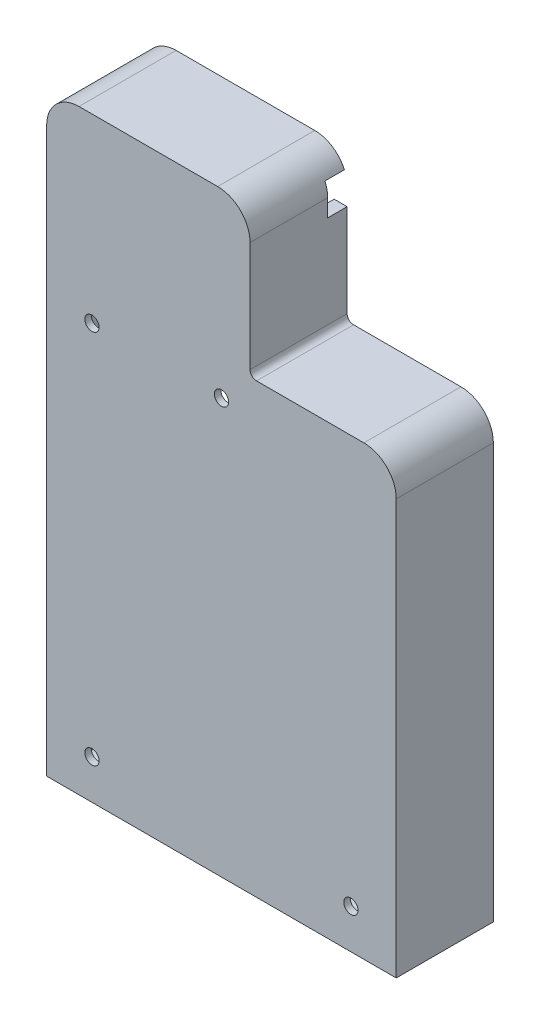
ISO-10303-21;
HEADER;
FILE_DESCRIPTION(('STEP AP214'),'2;1');
FILE_NAME('part.step','',(''),(''),'','','');
FILE_SCHEMA(('AUTOMOTIVE_DESIGN { 1 0 10303 214 1 1 1 1 }'));
ENDSEC;
DATA;
#1=APPLICATION_CONTEXT('core data for automotive mechanical design processes');
#2=APPLICATION_PROTOCOL_DEFINITION('international standard','automotive_design',2000,#1);
#3=PRODUCT_CONTEXT('',#1,'mechanical');
#4=PRODUCT('Part','Part','',(#3));
#5=PRODUCT_RELATED_PRODUCT_CATEGORY('part','',(#4));
#6=PRODUCT_DEFINITION_FORMATION('','',#4);
#7=PRODUCT_DEFINITION_CONTEXT('part definition',#1,'design');
#8=PRODUCT_DEFINITION('design','',#6,#7);
#9=PRODUCT_DEFINITION_SHAPE('','',#8);
#10=(LENGTH_UNIT() NAMED_UNIT(*) SI_UNIT(.MILLI.,.METRE.));
#11=(NAMED_UNIT(*) PLANE_ANGLE_UNIT() SI_UNIT($,.RADIAN.));
#12=(NAMED_UNIT(*) SI_UNIT($,.STERADIAN.) SOLID_ANGLE_UNIT());
#13=UNCERTAINTY_MEASURE_WITH_UNIT(LENGTH_MEASURE(1.E-05),#10,'distance_accuracy_value','');
#14=(GEOMETRIC_REPRESENTATION_CONTEXT(3) GLOBAL_UNCERTAINTY_ASSIGNED_CONTEXT((#13)) GLOBAL_UNIT_ASSIGNED_CONTEXT((#10,
#11,#12)) REPRESENTATION_CONTEXT('',''));
#15=CARTESIAN_POINT('',(0.,0.,0.));
#16=DIRECTION('',(0.,0.,1.));
#17=DIRECTION('',(1.,0.,0.));
#18=AXIS2_PLACEMENT_3D('',#15,#16,#17);
#19=CARTESIAN_POINT('',(834.649003168395,1097.58833023332,1303.47290301832));
#20=DIRECTION('',(0.,0.,1.));
#21=DIRECTION('',(1.,0.,0.));
#22=AXIS2_PLACEMENT_3D('',#19,#20,#21);
#23=PLANE('',#22);
#24=DIRECTION('',(-1.,0.,0.));
#25=VECTOR('',#24,1.);
#26=CARTESIAN_POINT('',(791.526705461344,1122.616605257,1303.47290301832));
#27=LINE('',#26,#25);
#28=CARTESIAN_POINT('',(788.439253952946,1122.616605257,1303.47290301832));
#29=VERTEX_POINT('',#28);
#30=CARTESIAN_POINT('',(786.0798629798,1122.616605257,1303.47290301832));
#31=VERTEX_POINT('',#30);
#32=EDGE_CURVE('E237',#29,#31,#27,.T.);
#33=ORIENTED_EDGE('',*,*,#32,.T.);
#34=CARTESIAN_POINT('',(790.651191574185,1120.58833023332,1303.47290301832));
#35=DIRECTION('',(0.,0.,1.));
#36=DIRECTION('',(1.,0.,0.));
#37=AXIS2_PLACEMENT_3D('',#34,#35,#36);
#38=CIRCLE('',#37,5.00109434919231);
#39=CARTESIAN_POINT('',(790.649732770005,1125.58942436975,1303.47290301832));
#40=VERTEX_POINT('',#39);
#41=EDGE_CURVE('E254',#40,#31,#38,.T.);
#42=ORIENTED_EDGE('',*,*,#41,.F.);
#43=DIRECTION('',(-1.,-1.14045923215985E-13,0.));
#44=VECTOR('',#43,1.);
#45=CARTESIAN_POINT('',(790.649732770005,1125.58942436975,1303.47290301832));
#46=LINE('',#45,#44);
#47=CARTESIAN_POINT('',(812.066461972588,1125.58942436976,1303.47290301832));
#48=VERTEX_POINT('',#47);
#49=EDGE_CURVE('E259',#48,#40,#46,.T.);
#50=ORIENTED_EDGE('',*,*,#49,.F.);
#51=CARTESIAN_POINT('',(812.065003168395,1120.58833023332,1303.47290301832));
#52=DIRECTION('',(0.,0.,1.));
#53=DIRECTION('',(1.,0.,0.));
#54=AXIS2_PLACEMENT_3D('',#51,#52,#53);
#55=CIRCLE('',#54,5.00109434919731);
#56=CARTESIAN_POINT('',(816.636331762786,1122.616605257,1303.47290301832));
#57=VERTEX_POINT('',#56);
#58=EDGE_CURVE('E453',#57,#48,#55,.T.);
#59=ORIENTED_EDGE('',*,*,#58,.F.);
#60=DIRECTION('',(-1.,0.,0.));
#61=VECTOR('',#60,1.);
#62=CARTESIAN_POINT('',(809.844363200608,1122.616605257,1303.47290301832));
#63=LINE('',#62,#61);
#64=CARTESIAN_POINT('',(814.276940789641,1122.616605257,1303.47290301832));
#65=VERTEX_POINT('',#64);
#66=EDGE_CURVE('E327',#57,#65,#63,.T.);
#67=ORIENTED_EDGE('',*,*,#66,.T.);
#68=CARTESIAN_POINT('',(812.065003168395,1120.58833023332,1303.47290301832));
#69=DIRECTION('',(0.,0.,1.));
#70=DIRECTION('',(1.,0.,0.));
#71=AXIS2_PLACEMENT_3D('',#68,#69,#70);
#72=CIRCLE('',#71,3.00109440237386);
#73=CARTESIAN_POINT('',(812.066097371295,1123.58942443622,1303.47290301832));
#74=VERTEX_POINT('',#73);
#75=EDGE_CURVE('E394',#65,#74,#72,.T.);
#76=ORIENTED_EDGE('',*,*,#75,.T.);
#77=DIRECTION('',(-1.,-2.28099612829224E-13,0.));
#78=VECTOR('',#77,1.);
#79=CARTESIAN_POINT('',(790.650097371295,1123.58942443622,1303.47290301832));
#80=LINE('',#79,#78);
#81=CARTESIAN_POINT('',(790.650097371295,1123.58942443622,1303.47290301832));
#82=VERTEX_POINT('',#81);
#83=EDGE_CURVE('E396',#74,#82,#80,.T.);
#84=ORIENTED_EDGE('',*,*,#83,.T.);
#85=CARTESIAN_POINT('',(790.651191574185,1120.58833023332,1303.47290301832));
#86=DIRECTION('',(0.,0.,1.));
#87=DIRECTION('',(1.,0.,0.));
#88=AXIS2_PLACEMENT_3D('',#85,#86,#87);
#89=CIRCLE('',#88,3.00109440236892);
#90=EDGE_CURVE('E356',#82,#29,#89,.T.);
#91=ORIENTED_EDGE('',*,*,#90,.T.);
#92=EDGE_LOOP('',(#33,#42,#50,#59,#67,#76,#84,#91));
#93=FACE_BOUND('',#92,.T.);
#94=ADVANCED_FACE('F41',(#93),#23,.F.);
#95=DIRECTION('',(1.,0.,0.));
#96=VECTOR('',#95,1.);
#97=CARTESIAN_POINT('',(791.526705461344,1117.89524788642,1303.47290301832));
#98=LINE('',#97,#96);
#99=CARTESIAN_POINT('',(785.650097436732,1117.89524788642,1303.47290301832));
#100=VERTEX_POINT('',#99);
#101=CARTESIAN_POINT('',(787.65009737129,1117.89524788642,1303.47290301832));
#102=VERTEX_POINT('',#101);
#103=EDGE_CURVE('E228',#100,#102,#98,.T.);
#104=ORIENTED_EDGE('',*,*,#103,.T.);
#105=DIRECTION('',(0.,-1.,0.));
#106=VECTOR('',#105,1.);
#107=CARTESIAN_POINT('',(787.650097371295,1035.49652121042,1303.47290301832));
#108=LINE('',#107,#106);
#109=CARTESIAN_POINT('',(787.650097371295,1035.49652121042,1303.47290301832));
#110=VERTEX_POINT('',#109);
#111=EDGE_CURVE('E247',#102,#110,#108,.T.);
#112=ORIENTED_EDGE('',*,*,#111,.T.);
#113=DIRECTION('',(1.,0.,0.));
#114=VECTOR('',#113,1.);
#115=CARTESIAN_POINT('',(787.650097371295,1035.49652121042,1303.47290301832));
#116=LINE('',#115,#114);
#117=CARTESIAN_POINT('',(837.650097371295,1035.49652121042,1303.47290301832));
#118=VERTEX_POINT('',#117);
#119=EDGE_CURVE('E376',#110,#118,#116,.T.);
#120=ORIENTED_EDGE('',*,*,#119,.T.);
#121=DIRECTION('',(0.,1.,0.));
#122=VECTOR('',#121,1.);
#123=CARTESIAN_POINT('',(837.650097371295,1097.58942443622,1303.47290301832));
#124=LINE('',#123,#122);
#125=CARTESIAN_POINT('',(837.650097371295,1097.58942443622,1303.47290301832));
#126=VERTEX_POINT('',#125);
#127=EDGE_CURVE('E379',#118,#126,#124,.T.);
#128=ORIENTED_EDGE('',*,*,#127,.T.);
#129=CARTESIAN_POINT('',(834.649003168395,1097.58833023332,1303.47290301832));
#130=DIRECTION('',(0.,0.,1.));
#131=DIRECTION('',(1.,0.,0.));
#132=AXIS2_PLACEMENT_3D('',#129,#130,#131);
#133=CIRCLE('',#132,3.00109440237403);
#134=CARTESIAN_POINT('',(834.650097371295,1100.58942443622,1303.47290301832));
#135=VERTEX_POINT('',#134);
#136=EDGE_CURVE('E382',#126,#135,#133,.T.);
#137=ORIENTED_EDGE('',*,*,#136,.T.);
#138=DIRECTION('',(-1.,0.,0.));
#139=VECTOR('',#138,1.);
#140=CARTESIAN_POINT('',(818.066097371295,1100.58942443622,1303.47290301832));
#141=LINE('',#140,#139);
#142=CARTESIAN_POINT('',(818.066097371295,1100.58942443622,1303.47290301832));
#143=VERTEX_POINT('',#142);
#144=EDGE_CURVE('E385',#135,#143,#141,.T.);
#145=ORIENTED_EDGE('',*,*,#144,.T.);
#146=CARTESIAN_POINT('',(818.067191574185,1103.59051863911,1303.47290301832));
#147=DIRECTION('',(0.,0.,-1.));
#148=DIRECTION('',(1.,0.,0.));
#149=AXIS2_PLACEMENT_3D('',#146,#147,#148);
#150=CIRCLE('',#149,3.00109440236392);
#151=CARTESIAN_POINT('',(815.066097371295,1103.58942443622,1303.47290301832));
#152=VERTEX_POINT('',#151);
#153=EDGE_CURVE('E388',#143,#152,#150,.T.);
#154=ORIENTED_EDGE('',*,*,#153,.T.);
#155=DIRECTION('',(0.,1.,0.));
#156=VECTOR('',#155,1.);
#157=CARTESIAN_POINT('',(815.066097371295,1120.58942443622,1303.47290301832));
#158=LINE('',#157,#156);
#159=CARTESIAN_POINT('',(815.066097371295,1117.89524788642,1303.47290301832));
#160=VERTEX_POINT('',#159);
#161=EDGE_CURVE('E391',#152,#160,#158,.T.);
#162=ORIENTED_EDGE('',*,*,#161,.T.);
#163=DIRECTION('',(1.,0.,0.));
#164=VECTOR('',#163,1.);
#165=CARTESIAN_POINT('',(809.844363200608,1117.89524788642,1303.47290301832));
#166=LINE('',#165,#164);
#167=CARTESIAN_POINT('',(817.066097304828,1117.89524788642,1303.47290301832));
#168=VERTEX_POINT('',#167);
#169=EDGE_CURVE('E330',#160,#168,#166,.T.);
#170=ORIENTED_EDGE('',*,*,#169,.T.);
#171=DIRECTION('',(0.,1.,0.));
#172=VECTOR('',#171,1.);
#173=CARTESIAN_POINT('',(817.066097304828,1120.58978903752,1303.47290301832));
#174=LINE('',#173,#172);
#175=CARTESIAN_POINT('',(817.066097304828,1103.58978903751,1303.47290301832));
#176=VERTEX_POINT('',#175);
#177=EDGE_CURVE('E450',#176,#168,#174,.T.);
#178=ORIENTED_EDGE('',*,*,#177,.F.);
#179=CARTESIAN_POINT('',(818.067191574185,1103.59051863911,1303.47290301832));
#180=DIRECTION('',(0.,0.,-1.));
#181=DIRECTION('',(1.,0.,0.));
#182=AXIS2_PLACEMENT_3D('',#179,#180,#181);
#183=CIRCLE('',#182,1.00109453522535);
#184=CARTESIAN_POINT('',(818.066461972585,1102.58942436976,1303.47290301832));
#185=VERTEX_POINT('',#184);
#186=EDGE_CURVE('E448',#185,#176,#183,.T.);
#187=ORIENTED_EDGE('',*,*,#186,.F.);
#188=DIRECTION('',(-1.,0.,0.));
#189=VECTOR('',#188,1.);
#190=CARTESIAN_POINT('',(818.066461972585,1102.58942436976,1303.47290301832));
#191=LINE('',#190,#189);
#192=CARTESIAN_POINT('',(834.650461972588,1102.58942436976,1303.47290301832));
#193=VERTEX_POINT('',#192);
#194=EDGE_CURVE('E446',#193,#185,#191,.T.);
#195=ORIENTED_EDGE('',*,*,#194,.F.);
#196=CARTESIAN_POINT('',(834.649003168395,1097.58833023332,1303.47290301832));
#197=DIRECTION('',(0.,0.,1.));
#198=DIRECTION('',(1.,0.,0.));
#199=AXIS2_PLACEMENT_3D('',#196,#197,#198);
#200=CIRCLE('',#199,5.00109434919747);
#201=CARTESIAN_POINT('',(839.650097304828,1097.58978903752,1303.47290301832));
#202=VERTEX_POINT('',#201);
#203=EDGE_CURVE('E424',#202,#193,#200,.T.);
#204=ORIENTED_EDGE('',*,*,#203,.F.);
#205=DIRECTION('',(-1.03703643668424E-09,1.,0.));
#206=VECTOR('',#205,1.);
#207=CARTESIAN_POINT('',(839.650097304828,1097.58978903752,1303.47290301832));
#208=LINE('',#207,#206);
#209=CARTESIAN_POINT('',(839.650097371295,1033.49652121042,1303.47290301832));
#210=VERTEX_POINT('',#209);
#211=EDGE_CURVE('E256',#210,#202,#208,.T.);
#212=ORIENTED_EDGE('',*,*,#211,.F.);
#213=DIRECTION('',(1.,0.,0.));
#214=VECTOR('',#213,1.);
#215=CARTESIAN_POINT('',(785.650097371295,1033.49652121042,1303.47290301832));
#216=LINE('',#215,#214);
#217=CARTESIAN_POINT('',(785.650097371295,1033.49652121042,1303.47290301832));
#218=VERTEX_POINT('',#217);
#219=EDGE_CURVE('E253',#218,#210,#216,.T.);
#220=ORIENTED_EDGE('',*,*,#219,.F.);
#221=DIRECTION('',(-7.63142929992677E-10,-1.,0.));
#222=VECTOR('',#221,1.);
#223=CARTESIAN_POINT('',(785.650097371295,1033.49652121042,1303.47290301832));
#224=LINE('',#223,#222);
#225=EDGE_CURVE('E243',#100,#218,#224,.T.);
#226=ORIENTED_EDGE('',*,*,#225,.F.);
#227=EDGE_LOOP('',(#104,#112,#120,#128,#137,#145,#154,#162,#170,#178,#187,#195,#204,#212,#220,#226));
#228=FACE_BOUND('',#227,.T.);
#229=ADVANCED_FACE('F251',(#228),#23,.F.);
#230=CARTESIAN_POINT('',(817.066097304828,1120.58978903752,1318.47290301832));
#231=DIRECTION('',(-1.,0.,0.));
#232=DIRECTION('',(0.,0.,1.));
#233=AXIS2_PLACEMENT_3D('',#230,#231,#232);
#234=PLANE('',#233);
#235=DIRECTION('',(0.,0.,-1.));
#236=VECTOR('',#235,1.);
#237=CARTESIAN_POINT('',(817.066097304828,1117.89524788642,1318.47290301832));
#238=LINE('',#237,#236);
#239=CARTESIAN_POINT('',(817.066097304828,1117.89524788642,1306.47290301832));
#240=VERTEX_POINT('',#239);
#241=EDGE_CURVE('E248',#240,#168,#238,.T.);
#242=ORIENTED_EDGE('',*,*,#241,.F.);
#243=DIRECTION('',(0.,1.,0.));
#244=VECTOR('',#243,1.);
#245=CARTESIAN_POINT('',(817.066097304828,1120.58978903752,1306.47290301832));
#246=LINE('',#245,#244);
#247=CARTESIAN_POINT('',(817.066097304828,1120.58978903752,1306.47290301832));
#248=VERTEX_POINT('',#247);
#249=EDGE_CURVE('E346',#240,#248,#246,.T.);
#250=ORIENTED_EDGE('',*,*,#249,.T.);
#251=DIRECTION('',(0.,0.,-1.));
#252=VECTOR('',#251,1.);
#253=CARTESIAN_POINT('',(817.066097304828,1120.58978903752,1318.47290301832));
#254=LINE('',#253,#252);
#255=CARTESIAN_POINT('',(817.066097304828,1120.58978903752,1318.47290301832));
#256=VERTEX_POINT('',#255);
#257=EDGE_CURVE('E282',#256,#248,#254,.T.);
#258=ORIENTED_EDGE('',*,*,#257,.F.);
#259=DIRECTION('',(0.,1.,0.));
#260=VECTOR('',#259,1.);
#261=CARTESIAN_POINT('',(817.066097304828,1120.58978903752,1318.47290301832));
#262=LINE('',#261,#260);
#263=CARTESIAN_POINT('',(817.066097304828,1103.58978903751,1318.47290301832));
#264=VERTEX_POINT('',#263);
#265=EDGE_CURVE('E431',#264,#256,#262,.T.);
#266=ORIENTED_EDGE('',*,*,#265,.F.);
#267=DIRECTION('',(0.,0.,-1.));
#268=VECTOR('',#267,1.);
#269=CARTESIAN_POINT('',(817.066097304828,1103.58978903751,1318.47290301832));
#270=LINE('',#269,#268);
#271=EDGE_CURVE('E285',#264,#176,#270,.T.);
#272=ORIENTED_EDGE('',*,*,#271,.T.);
#273=ORIENTED_EDGE('',*,*,#177,.T.);
#274=EDGE_LOOP('',(#242,#250,#258,#266,#272,#273));
#275=FACE_BOUND('',#274,.T.);
#276=ADVANCED_FACE('F538',(#275),#234,.F.);
#277=CARTESIAN_POINT('',(812.065003168395,1120.58833023332,1318.47290301832));
#278=DIRECTION('',(0.,0.,-1.));
#279=DIRECTION('',(-1.,0.,0.));
#280=AXIS2_PLACEMENT_3D('',#277,#278,#279);
#281=CYLINDRICAL_SURFACE('',#280,5.00109434919731);
#282=DIRECTION('',(0.,0.,-1.));
#283=VECTOR('',#282,1.);
#284=CARTESIAN_POINT('',(816.636331762786,1122.616605257,1318.47290301832));
#285=LINE('',#284,#283);
#286=CARTESIAN_POINT('',(816.636331762786,1122.616605257,1306.47290301832));
#287=VERTEX_POINT('',#286);
#288=EDGE_CURVE('E349',#57,#287,#285,.F.);
#289=ORIENTED_EDGE('',*,*,#288,.F.);
#290=ORIENTED_EDGE('',*,*,#58,.T.);
#291=DIRECTION('',(0.,0.,-1.));
#292=VECTOR('',#291,1.);
#293=CARTESIAN_POINT('',(812.066461972588,1125.58942436976,1318.47290301832));
#294=LINE('',#293,#292);
#295=CARTESIAN_POINT('',(812.066461972588,1125.58942436976,1318.47290301832));
#296=VERTEX_POINT('',#295);
#297=EDGE_CURVE('E279',#296,#48,#294,.T.);
#298=ORIENTED_EDGE('',*,*,#297,.F.);
#299=CARTESIAN_POINT('',(812.065003168395,1120.58833023332,1318.47290301832));
#300=DIRECTION('',(0.,0.,1.));
#301=DIRECTION('',(1.,0.,0.));
#302=AXIS2_PLACEMENT_3D('',#299,#300,#301);
#303=CIRCLE('',#302,5.00109434919731);
#304=EDGE_CURVE('E433',#256,#296,#303,.T.);
#305=ORIENTED_EDGE('',*,*,#304,.F.);
#306=ORIENTED_EDGE('',*,*,#257,.T.);
#307=CARTESIAN_POINT('',(812.065003168395,1120.58833023332,1306.47290301832));
#308=DIRECTION('',(0.,0.,1.));
#309=DIRECTION('',(1.,0.,0.));
#310=AXIS2_PLACEMENT_3D('',#307,#308,#309);
#311=CIRCLE('',#310,5.00109434919731);
#312=EDGE_CURVE('E343',#248,#287,#311,.T.);
#313=ORIENTED_EDGE('',*,*,#312,.T.);
#314=EDGE_LOOP('',(#289,#290,#298,#305,#306,#313));
#315=FACE_BOUND('',#314,.T.);
#316=ADVANCED_FACE('F502',(#315),#281,.T.);
#317=CARTESIAN_POINT('',(790.651191574185,1120.58833023332,1318.47290301832));
#318=DIRECTION('',(0.,0.,-1.));
#319=DIRECTION('',(-1.,0.,0.));
#320=AXIS2_PLACEMENT_3D('',#317,#318,#319);
#321=CYLINDRICAL_SURFACE('',#320,5.00109434919231);
#322=DIRECTION('',(0.,0.,-1.));
#323=VECTOR('',#322,1.);
#324=CARTESIAN_POINT('',(786.0798629798,1122.616605257,1318.47290301832));
#325=LINE('',#324,#323);
#326=CARTESIAN_POINT('',(786.0798629798,1122.616605257,1306.47290301832));
#327=VERTEX_POINT('',#326);
#328=EDGE_CURVE('E340',#327,#31,#325,.T.);
#329=ORIENTED_EDGE('',*,*,#328,.F.);
#330=CARTESIAN_POINT('',(790.651191574185,1120.58833023332,1306.47290301832));
#331=DIRECTION('',(0.,0.,-1.));
#332=DIRECTION('',(-1.,0.,0.));
#333=AXIS2_PLACEMENT_3D('',#330,#331,#332);
#334=CIRCLE('',#333,5.00109434919231);
#335=CARTESIAN_POINT('',(785.65009743776,1120.58978903752,1306.47290301832));
#336=VERTEX_POINT('',#335);
#337=EDGE_CURVE('E338',#336,#327,#334,.T.);
#338=ORIENTED_EDGE('',*,*,#337,.F.);
#339=DIRECTION('',(0.,0.,-1.));
#340=VECTOR('',#339,1.);
#341=CARTESIAN_POINT('',(785.65009743776,1120.58978903752,1318.47290301832));
#342=LINE('',#341,#340);
#343=CARTESIAN_POINT('',(785.65009743776,1120.58978903752,1318.47290301832));
#344=VERTEX_POINT('',#343);
#345=EDGE_CURVE('E274',#344,#336,#342,.T.);
#346=ORIENTED_EDGE('',*,*,#345,.F.);
#347=CARTESIAN_POINT('',(790.651191574185,1120.58833023332,1318.47290301832));
#348=DIRECTION('',(0.,0.,1.));
#349=DIRECTION('',(1.,0.,0.));
#350=AXIS2_PLACEMENT_3D('',#347,#348,#349);
#351=CIRCLE('',#350,5.00109434919231);
#352=CARTESIAN_POINT('',(790.649732770005,1125.58942436975,1318.47290301832));
#353=VERTEX_POINT('',#352);
#354=EDGE_CURVE('E437',#353,#344,#351,.T.);
#355=ORIENTED_EDGE('',*,*,#354,.F.);
#356=DIRECTION('',(0.,0.,-1.));
#357=VECTOR('',#356,1.);
#358=CARTESIAN_POINT('',(790.649732770005,1125.58942436975,1318.47290301832));
#359=LINE('',#358,#357);
#360=EDGE_CURVE('E276',#353,#40,#359,.T.);
#361=ORIENTED_EDGE('',*,*,#360,.T.);
#362=ORIENTED_EDGE('',*,*,#41,.T.);
#363=EDGE_LOOP('',(#329,#338,#346,#355,#361,#362));
#364=FACE_BOUND('',#363,.T.);
#365=ADVANCED_FACE('F466',(#364),#321,.T.);
#366=CARTESIAN_POINT('',(785.650097371295,1033.49652121042,1318.47290301832));
#367=DIRECTION('',(1.,-7.63142929992677E-10,0.));
#368=DIRECTION('',(7.63142929992677E-10,1.,0.));
#369=AXIS2_PLACEMENT_3D('',#366,#367,#368);
#370=PLANE('',#369);
#371=DIRECTION('',(0.,0.,1.));
#372=VECTOR('',#371,1.);
#373=CARTESIAN_POINT('',(785.650097435704,1117.89524788642,1318.47290301832));
#374=LINE('',#373,#372);
#375=CARTESIAN_POINT('',(785.650097436732,1117.89524788642,1306.47290301832));
#376=VERTEX_POINT('',#375);
#377=EDGE_CURVE('E232',#100,#376,#374,.T.);
#378=ORIENTED_EDGE('',*,*,#377,.F.);
#379=ORIENTED_EDGE('',*,*,#225,.T.);
#380=DIRECTION('',(0.,0.,-1.));
#381=VECTOR('',#380,1.);
#382=CARTESIAN_POINT('',(785.650097371295,1033.49652121042,1318.47290301832));
#383=LINE('',#382,#381);
#384=CARTESIAN_POINT('',(785.650097371295,1033.49652121042,1318.47290301832));
#385=VERTEX_POINT('',#384);
#386=EDGE_CURVE('E272',#385,#218,#383,.T.);
#387=ORIENTED_EDGE('',*,*,#386,.F.);
#388=DIRECTION('',(-7.63142929992677E-10,-1.,0.));
#389=VECTOR('',#388,1.);
#390=CARTESIAN_POINT('',(785.650097371295,1033.49652121042,1318.47290301832));
#391=LINE('',#390,#389);
#392=EDGE_CURVE('E439',#344,#385,#391,.T.);
#393=ORIENTED_EDGE('',*,*,#392,.F.);
#394=ORIENTED_EDGE('',*,*,#345,.T.);
#395=DIRECTION('',(7.63142929992677E-10,1.,0.));
#396=VECTOR('',#395,1.);
#397=CARTESIAN_POINT('',(785.650097371295,1033.49652121042,1306.47290301832));
#398=LINE('',#397,#396);
#399=EDGE_CURVE('E246',#376,#336,#398,.T.);
#400=ORIENTED_EDGE('',*,*,#399,.F.);
#401=EDGE_LOOP('',(#378,#379,#387,#393,#394,#400));
#402=FACE_BOUND('',#401,.T.);
#403=ADVANCED_FACE('F241',(#402),#370,.F.);
#404=CARTESIAN_POINT('',(787.650097371295,1035.49652121042,1317.47290301832));
#405=DIRECTION('',(1.,0.,0.));
#406=DIRECTION('',(0.,1.,0.));
#407=AXIS2_PLACEMENT_3D('',#404,#405,#406);
#408=PLANE('',#407);
#409=ORIENTED_EDGE('',*,*,#111,.F.);
#410=DIRECTION('',(0.,0.,1.));
#411=VECTOR('',#410,1.);
#412=CARTESIAN_POINT('',(787.65009737129,1117.89524788642,1317.47290301832));
#413=LINE('',#412,#411);
#414=CARTESIAN_POINT('',(787.65009737129,1117.89524788642,1306.47290301832));
#415=VERTEX_POINT('',#414);
#416=EDGE_CURVE('E11',#102,#415,#413,.T.);
#417=ORIENTED_EDGE('',*,*,#416,.T.);
#418=DIRECTION('',(0.,1.,0.));
#419=VECTOR('',#418,1.);
#420=CARTESIAN_POINT('',(787.650097371295,1035.49652121042,1306.47290301832));
#421=LINE('',#420,#419);
#422=CARTESIAN_POINT('',(787.65009737129,1120.58942443622,1306.47290301832));
#423=VERTEX_POINT('',#422);
#424=EDGE_CURVE('E333',#415,#423,#421,.T.);
#425=ORIENTED_EDGE('',*,*,#424,.T.);
#426=DIRECTION('',(0.,0.,-1.));
#427=VECTOR('',#426,1.);
#428=CARTESIAN_POINT('',(787.65009737129,1120.58942443622,1317.47290301832));
#429=LINE('',#428,#427);
#430=CARTESIAN_POINT('',(787.65009737129,1120.58942443622,1317.47290301832));
#431=VERTEX_POINT('',#430);
#432=EDGE_CURVE('E374',#431,#423,#429,.T.);
#433=ORIENTED_EDGE('',*,*,#432,.F.);
#434=DIRECTION('',(0.,-1.,0.));
#435=VECTOR('',#434,1.);
#436=CARTESIAN_POINT('',(787.650097371295,1035.49652121042,1317.47290301832));
#437=LINE('',#436,#435);
#438=CARTESIAN_POINT('',(787.650097371295,1035.49652121042,1317.47290301832));
#439=VERTEX_POINT('',#438);
#440=EDGE_CURVE('E352',#431,#439,#437,.T.);
#441=ORIENTED_EDGE('',*,*,#440,.T.);
#442=DIRECTION('',(0.,0.,-1.));
#443=VECTOR('',#442,1.);
#444=CARTESIAN_POINT('',(787.650097371295,1035.49652121042,1317.47290301832));
#445=LINE('',#444,#443);
#446=EDGE_CURVE('E421',#439,#110,#445,.T.);
#447=ORIENTED_EDGE('',*,*,#446,.T.);
#448=EDGE_LOOP('',(#409,#417,#425,#433,#441,#447));
#449=FACE_BOUND('',#448,.T.);
#450=ADVANCED_FACE('F517',(#449),#408,.T.);
#451=CARTESIAN_POINT('',(815.066097371295,1120.58942443622,1317.47290301832));
#452=DIRECTION('',(-1.,0.,0.));
#453=DIRECTION('',(0.,0.,1.));
#454=AXIS2_PLACEMENT_3D('',#451,#452,#453);
#455=PLANE('',#454);
#456=DIRECTION('',(0.,1.,0.));
#457=VECTOR('',#456,1.);
#458=CARTESIAN_POINT('',(815.066097371295,1120.58942443622,1306.47290301832));
#459=LINE('',#458,#457);
#460=CARTESIAN_POINT('',(815.066097371295,1117.89524788642,1306.47290301832));
#461=VERTEX_POINT('',#460);
#462=CARTESIAN_POINT('',(815.066097371295,1120.58942443622,1306.47290301832));
#463=VERTEX_POINT('',#462);
#464=EDGE_CURVE('E58',#461,#463,#459,.T.);
#465=ORIENTED_EDGE('',*,*,#464,.F.);
#466=DIRECTION('',(0.,0.,-1.));
#467=VECTOR('',#466,1.);
#468=CARTESIAN_POINT('',(815.066097371295,1117.89524788642,1317.47290301832));
#469=LINE('',#468,#467);
#470=EDGE_CURVE('E50',#461,#160,#469,.T.);
#471=ORIENTED_EDGE('',*,*,#470,.T.);
#472=ORIENTED_EDGE('',*,*,#161,.F.);
#473=DIRECTION('',(0.,0.,-1.));
#474=VECTOR('',#473,1.);
#475=CARTESIAN_POINT('',(815.066097371295,1103.58942443622,1317.47290301832));
#476=LINE('',#475,#474);
#477=CARTESIAN_POINT('',(815.066097371295,1103.58942443622,1317.47290301832));
#478=VERTEX_POINT('',#477);
#479=EDGE_CURVE('E411',#478,#152,#476,.T.);
#480=ORIENTED_EDGE('',*,*,#479,.F.);
#481=DIRECTION('',(0.,1.,0.));
#482=VECTOR('',#481,1.);
#483=CARTESIAN_POINT('',(815.066097371295,1120.58942443622,1317.47290301832));
#484=LINE('',#483,#482);
#485=CARTESIAN_POINT('',(815.066097371295,1120.58942443622,1317.47290301832));
#486=VERTEX_POINT('',#485);
#487=EDGE_CURVE('E366',#478,#486,#484,.T.);
#488=ORIENTED_EDGE('',*,*,#487,.T.);
#489=DIRECTION('',(0.,0.,-1.));
#490=VECTOR('',#489,1.);
#491=CARTESIAN_POINT('',(815.066097371295,1120.58942443622,1317.47290301832));
#492=LINE('',#491,#490);
#493=EDGE_CURVE('E408',#486,#463,#492,.T.);
#494=ORIENTED_EDGE('',*,*,#493,.T.);
#495=EDGE_LOOP('',(#465,#471,#472,#480,#488,#494));
#496=FACE_BOUND('',#495,.T.);
#497=ADVANCED_FACE('F506',(#496),#455,.T.);
#498=CARTESIAN_POINT('',(812.065003168395,1120.58833023332,1317.47290301832));
#499=DIRECTION('',(0.,0.,-1.));
#500=DIRECTION('',(-1.,0.,0.));
#501=AXIS2_PLACEMENT_3D('',#498,#499,#500);
#502=CYLINDRICAL_SURFACE('',#501,3.00109440237386);
#503=ORIENTED_EDGE('',*,*,#75,.F.);
#504=DIRECTION('',(0.,0.,-1.));
#505=VECTOR('',#504,1.);
#506=CARTESIAN_POINT('',(814.276940789641,1122.616605257,1317.47290301832));
#507=LINE('',#506,#505);
#508=CARTESIAN_POINT('',(814.276940789641,1122.616605257,1306.47290301832));
#509=VERTEX_POINT('',#508);
#510=EDGE_CURVE('E302',#65,#509,#507,.F.);
#511=ORIENTED_EDGE('',*,*,#510,.T.);
#512=CARTESIAN_POINT('',(812.065003168395,1120.58833023332,1306.47290301832));
#513=DIRECTION('',(0.,0.,1.));
#514=DIRECTION('',(1.,0.,0.));
#515=AXIS2_PLACEMENT_3D('',#512,#513,#514);
#516=CIRCLE('',#515,3.00109440237386);
#517=EDGE_CURVE('E300',#463,#509,#516,.T.);
#518=ORIENTED_EDGE('',*,*,#517,.F.);
#519=ORIENTED_EDGE('',*,*,#493,.F.);
#520=CARTESIAN_POINT('',(812.065003168395,1120.58833023332,1317.47290301832));
#521=DIRECTION('',(0.,0.,1.));
#522=DIRECTION('',(1.,0.,0.));
#523=AXIS2_PLACEMENT_3D('',#520,#521,#522);
#524=CIRCLE('',#523,3.00109440237386);
#525=CARTESIAN_POINT('',(812.066097371295,1123.58942443622,1317.47290301832));
#526=VERTEX_POINT('',#525);
#527=EDGE_CURVE('E368',#486,#526,#524,.T.);
#528=ORIENTED_EDGE('',*,*,#527,.T.);
#529=DIRECTION('',(0.,0.,-1.));
#530=VECTOR('',#529,1.);
#531=CARTESIAN_POINT('',(812.066097371295,1123.58942443622,1317.47290301832));
#532=LINE('',#531,#530);
#533=EDGE_CURVE('E405',#526,#74,#532,.T.);
#534=ORIENTED_EDGE('',*,*,#533,.T.);
#535=EDGE_LOOP('',(#503,#511,#518,#519,#528,#534));
#536=FACE_BOUND('',#535,.T.);
#537=ADVANCED_FACE('F479',(#536),#502,.F.);
#538=CARTESIAN_POINT('',(790.651191574185,1120.58833023332,1317.47290301832));
#539=DIRECTION('',(0.,0.,-1.));
#540=DIRECTION('',(-1.,0.,0.));
#541=AXIS2_PLACEMENT_3D('',#538,#539,#540);
#542=CYLINDRICAL_SURFACE('',#541,3.00109440236892);
#543=CARTESIAN_POINT('',(790.651191574185,1120.58833023332,1306.47290301832));
#544=DIRECTION('',(0.,0.,-1.));
#545=DIRECTION('',(-1.,0.,0.));
#546=AXIS2_PLACEMENT_3D('',#543,#544,#545);
#547=CIRCLE('',#546,3.00109440236892);
#548=CARTESIAN_POINT('',(788.439253952946,1122.616605257,1306.47290301832));
#549=VERTEX_POINT('',#548);
#550=EDGE_CURVE('E294',#423,#549,#547,.T.);
#551=ORIENTED_EDGE('',*,*,#550,.T.);
#552=DIRECTION('',(0.,0.,-1.));
#553=VECTOR('',#552,1.);
#554=CARTESIAN_POINT('',(788.439253952946,1122.616605257,1317.47290301832));
#555=LINE('',#554,#553);
#556=EDGE_CURVE('E297',#549,#29,#555,.T.);
#557=ORIENTED_EDGE('',*,*,#556,.T.);
#558=ORIENTED_EDGE('',*,*,#90,.F.);
#559=DIRECTION('',(0.,0.,-1.));
#560=VECTOR('',#559,1.);
#561=CARTESIAN_POINT('',(790.650097371295,1123.58942443622,1317.47290301832));
#562=LINE('',#561,#560);
#563=CARTESIAN_POINT('',(790.650097371295,1123.58942443622,1317.47290301832));
#564=VERTEX_POINT('',#563);
#565=EDGE_CURVE('E403',#564,#82,#562,.T.);
#566=ORIENTED_EDGE('',*,*,#565,.F.);
#567=CARTESIAN_POINT('',(790.651191574185,1120.58833023332,1317.47290301832));
#568=DIRECTION('',(0.,0.,1.));
#569=DIRECTION('',(1.,0.,0.));
#570=AXIS2_PLACEMENT_3D('',#567,#568,#569);
#571=CIRCLE('',#570,3.00109440236892);
#572=EDGE_CURVE('E372',#564,#431,#571,.T.);
#573=ORIENTED_EDGE('',*,*,#572,.T.);
#574=ORIENTED_EDGE('',*,*,#432,.T.);
#575=EDGE_LOOP('',(#551,#557,#558,#566,#573,#574));
#576=FACE_BOUND('',#575,.T.);
#577=ADVANCED_FACE('F490',(#576),#542,.F.);
#578=CARTESIAN_POINT('',(834.649003168395,1097.58833023332,1318.47290301832));
#579=DIRECTION('',(0.,0.,1.));
#580=DIRECTION('',(1.,0.,0.));
#581=AXIS2_PLACEMENT_3D('',#578,#579,#580);
#582=PLANE('',#581);
#583=CARTESIAN_POINT('',(832.650097371295,1039.58942443622,1318.47290301832));
#584=DIRECTION('',(0.,0.,1.));
#585=DIRECTION('',(1.,0.,0.));
#586=AXIS2_PLACEMENT_3D('',#583,#584,#585);
#587=CIRCLE('',#586,1.09999999999997);
#588=CARTESIAN_POINT('',(833.750097371295,1039.58942443622,1318.47290301832));
#589=VERTEX_POINT('',#588);
#590=EDGE_CURVE('E311',#589,#589,#587,.T.);
#591=ORIENTED_EDGE('',*,*,#590,.F.);
#592=EDGE_LOOP('',(#591));
#593=FACE_BOUND('',#592,.T.);
#594=CARTESIAN_POINT('',(792.650097371295,1039.58942443622,1318.47290301832));
#595=DIRECTION('',(0.,0.,1.));
#596=DIRECTION('',(1.,0.,0.));
#597=AXIS2_PLACEMENT_3D('',#594,#595,#596);
#598=CIRCLE('',#597,1.10000000000008);
#599=CARTESIAN_POINT('',(793.750097371295,1039.58942443622,1318.47290301832));
#600=VERTEX_POINT('',#599);
#601=EDGE_CURVE('E792',#600,#600,#598,.T.);
#602=ORIENTED_EDGE('',*,*,#601,.F.);
#603=EDGE_LOOP('',(#602));
#604=FACE_BOUND('',#603,.T.);
#605=CARTESIAN_POINT('',(792.650097371295,1097.58942443622,1318.47290301832));
#606=DIRECTION('',(0.,0.,1.));
#607=DIRECTION('',(1.,0.,0.));
#608=AXIS2_PLACEMENT_3D('',#605,#606,#607);
#609=CIRCLE('',#608,1.10000000000008);
#610=CARTESIAN_POINT('',(793.750097371295,1097.58942443622,1318.47290301832));
#611=VERTEX_POINT('',#610);
#612=EDGE_CURVE('E795',#611,#611,#609,.T.);
#613=ORIENTED_EDGE('',*,*,#612,.F.);
#614=EDGE_LOOP('',(#613));
#615=FACE_BOUND('',#614,.T.);
#616=CARTESIAN_POINT('',(812.650097371295,1097.58942443622,1318.47290301832));
#617=DIRECTION('',(0.,0.,1.));
#618=DIRECTION('',(1.,0.,0.));
#619=AXIS2_PLACEMENT_3D('',#616,#617,#618);
#620=CIRCLE('',#619,1.09999999999997);
#621=CARTESIAN_POINT('',(813.750097371295,1097.58942443622,1318.47290301832));
#622=VERTEX_POINT('',#621);
#623=EDGE_CURVE('E800',#622,#622,#620,.T.);
#624=ORIENTED_EDGE('',*,*,#623,.F.);
#625=EDGE_LOOP('',(#624));
#626=FACE_BOUND('',#625,.T.);
#627=CARTESIAN_POINT('',(834.649003168395,1097.58833023332,1318.47290301832));
#628=DIRECTION('',(0.,0.,1.));
#629=DIRECTION('',(1.,0.,0.));
#630=AXIS2_PLACEMENT_3D('',#627,#628,#629);
#631=CIRCLE('',#630,5.00109434919747);
#632=CARTESIAN_POINT('',(839.650097304828,1097.58978903752,1318.47290301832));
#633=VERTEX_POINT('',#632);
#634=CARTESIAN_POINT('',(834.650461972588,1102.58942436976,1318.47290301832));
#635=VERTEX_POINT('',#634);
#636=EDGE_CURVE('E264',#633,#635,#631,.T.);
#637=ORIENTED_EDGE('',*,*,#636,.T.);
#638=DIRECTION('',(-1.,0.,0.));
#639=VECTOR('',#638,1.);
#640=CARTESIAN_POINT('',(818.066461972585,1102.58942436976,1318.47290301832));
#641=LINE('',#640,#639);
#642=CARTESIAN_POINT('',(818.066461972585,1102.58942436976,1318.47290301832));
#643=VERTEX_POINT('',#642);
#644=EDGE_CURVE('E427',#635,#643,#641,.T.);
#645=ORIENTED_EDGE('',*,*,#644,.T.);
#646=CARTESIAN_POINT('',(818.067191574185,1103.59051863911,1318.47290301832));
#647=DIRECTION('',(0.,0.,-1.));
#648=DIRECTION('',(1.,0.,0.));
#649=AXIS2_PLACEMENT_3D('',#646,#647,#648);
#650=CIRCLE('',#649,1.00109453522535);
#651=EDGE_CURVE('E429',#643,#264,#650,.T.);
#652=ORIENTED_EDGE('',*,*,#651,.T.);
#653=ORIENTED_EDGE('',*,*,#265,.T.);
#654=ORIENTED_EDGE('',*,*,#304,.T.);
#655=DIRECTION('',(-1.,-1.14045923215985E-13,0.));
#656=VECTOR('',#655,1.);
#657=CARTESIAN_POINT('',(790.649732770005,1125.58942436975,1318.47290301832));
#658=LINE('',#657,#656);
#659=EDGE_CURVE('E435',#296,#353,#658,.T.);
#660=ORIENTED_EDGE('',*,*,#659,.T.);
#661=ORIENTED_EDGE('',*,*,#354,.T.);
#662=ORIENTED_EDGE('',*,*,#392,.T.);
#663=DIRECTION('',(1.,0.,0.));
#664=VECTOR('',#663,1.);
#665=CARTESIAN_POINT('',(785.650097371295,1033.49652121042,1318.47290301832));
#666=LINE('',#665,#664);
#667=CARTESIAN_POINT('',(839.650097371295,1033.49652121042,1318.47290301832));
#668=VERTEX_POINT('',#667);
#669=EDGE_CURVE('E441',#385,#668,#666,.T.);
#670=ORIENTED_EDGE('',*,*,#669,.T.);
#671=DIRECTION('',(-1.03703643668424E-09,1.,0.));
#672=VECTOR('',#671,1.);
#673=CARTESIAN_POINT('',(839.650097304828,1097.58978903752,1318.47290301832));
#674=LINE('',#673,#672);
#675=EDGE_CURVE('E269',#668,#633,#674,.T.);
#676=ORIENTED_EDGE('',*,*,#675,.T.);
#677=EDGE_LOOP('',(#637,#645,#652,#653,#654,#660,#661,#662,#670,#676));
#678=FACE_BOUND('',#677,.T.);
#679=ADVANCED_FACE('F496',(#593,#604,#615,#626,#678),#582,.T.);
#680=CARTESIAN_POINT('',(834.649003168395,1097.58833023332,1318.47290301832));
#681=DIRECTION('',(0.,0.,-1.));
#682=DIRECTION('',(-1.,0.,0.));
#683=AXIS2_PLACEMENT_3D('',#680,#681,#682);
#684=CYLINDRICAL_SURFACE('',#683,5.00109434919747);
#685=ORIENTED_EDGE('',*,*,#203,.T.);
#686=DIRECTION('',(0.,0.,-1.));
#687=VECTOR('',#686,1.);
#688=CARTESIAN_POINT('',(834.650461972588,1102.58942436976,1318.47290301832));
#689=LINE('',#688,#687);
#690=EDGE_CURVE('E291',#635,#193,#689,.T.);
#691=ORIENTED_EDGE('',*,*,#690,.F.);
#692=ORIENTED_EDGE('',*,*,#636,.F.);
#693=DIRECTION('',(0.,0.,-1.));
#694=VECTOR('',#693,1.);
#695=CARTESIAN_POINT('',(839.650097304828,1097.58978903752,1318.47290301832));
#696=LINE('',#695,#694);
#697=EDGE_CURVE('E265',#633,#202,#696,.T.);
#698=ORIENTED_EDGE('',*,*,#697,.T.);
#699=EDGE_LOOP('',(#685,#691,#692,#698));
#700=FACE_BOUND('',#699,.T.);
#701=ADVANCED_FACE('F43',(#700),#684,.T.);
#702=CARTESIAN_POINT('',(818.066461972585,1102.58942436976,1318.47290301832));
#703=DIRECTION('',(0.,-1.,0.));
#704=DIRECTION('',(0.,0.,-1.));
#705=AXIS2_PLACEMENT_3D('',#702,#703,#704);
#706=PLANE('',#705);
#707=ORIENTED_EDGE('',*,*,#194,.T.);
#708=DIRECTION('',(0.,0.,-1.));
#709=VECTOR('',#708,1.);
#710=CARTESIAN_POINT('',(818.066461972585,1102.58942436976,1318.47290301832));
#711=LINE('',#710,#709);
#712=EDGE_CURVE('E288',#643,#185,#711,.T.);
#713=ORIENTED_EDGE('',*,*,#712,.F.);
#714=ORIENTED_EDGE('',*,*,#644,.F.);
#715=ORIENTED_EDGE('',*,*,#690,.T.);
#716=EDGE_LOOP('',(#707,#713,#714,#715));
#717=FACE_BOUND('',#716,.T.);
#718=ADVANCED_FACE('F564',(#717),#706,.F.);
#719=CARTESIAN_POINT('',(818.067191574185,1103.59051863911,1318.47290301832));
#720=DIRECTION('',(0.,0.,-1.));
#721=DIRECTION('',(-1.,0.,0.));
#722=AXIS2_PLACEMENT_3D('',#719,#720,#721);
#723=CYLINDRICAL_SURFACE('',#722,1.00109453522535);
#724=ORIENTED_EDGE('',*,*,#186,.T.);
#725=ORIENTED_EDGE('',*,*,#271,.F.);
#726=ORIENTED_EDGE('',*,*,#651,.F.);
#727=ORIENTED_EDGE('',*,*,#712,.T.);
#728=EDGE_LOOP('',(#724,#725,#726,#727));
#729=FACE_BOUND('',#728,.T.);
#730=ADVANCED_FACE('F557',(#729),#723,.F.);
#731=CARTESIAN_POINT('',(790.649732770005,1125.58942436975,1318.47290301832));
#732=DIRECTION('',(1.14045923215985E-13,-1.,0.));
#733=DIRECTION('',(1.,1.14045923215985E-13,0.));
#734=AXIS2_PLACEMENT_3D('',#731,#732,#733);
#735=PLANE('',#734);
#736=ORIENTED_EDGE('',*,*,#49,.T.);
#737=ORIENTED_EDGE('',*,*,#360,.F.);
#738=ORIENTED_EDGE('',*,*,#659,.F.);
#739=ORIENTED_EDGE('',*,*,#297,.T.);
#740=EDGE_LOOP('',(#736,#737,#738,#739));
#741=FACE_BOUND('',#740,.T.);
#742=ADVANCED_FACE('F457',(#741),#735,.F.);
#743=CARTESIAN_POINT('',(785.650097371295,1033.49652121042,1318.47290301832));
#744=DIRECTION('',(0.,1.,0.));
#745=DIRECTION('',(0.,0.,1.));
#746=AXIS2_PLACEMENT_3D('',#743,#744,#745);
#747=PLANE('',#746);
#748=ORIENTED_EDGE('',*,*,#219,.T.);
#749=DIRECTION('',(0.,0.,-1.));
#750=VECTOR('',#749,1.);
#751=CARTESIAN_POINT('',(839.650097371295,1033.49652121042,1318.47290301832));
#752=LINE('',#751,#750);
#753=EDGE_CURVE('E268',#668,#210,#752,.T.);
#754=ORIENTED_EDGE('',*,*,#753,.F.);
#755=ORIENTED_EDGE('',*,*,#669,.F.);
#756=ORIENTED_EDGE('',*,*,#386,.T.);
#757=EDGE_LOOP('',(#748,#754,#755,#756));
#758=FACE_BOUND('',#757,.T.);
#759=ADVANCED_FACE('F546',(#758),#747,.F.);
#760=CARTESIAN_POINT('',(839.650097304828,1097.58978903752,1318.47290301832));
#761=DIRECTION('',(-1.,-1.03703643668424E-09,0.));
#762=DIRECTION('',(1.03703643668424E-09,-1.,0.));
#763=AXIS2_PLACEMENT_3D('',#760,#761,#762);
#764=PLANE('',#763);
#765=ORIENTED_EDGE('',*,*,#211,.T.);
#766=ORIENTED_EDGE('',*,*,#697,.F.);
#767=ORIENTED_EDGE('',*,*,#675,.F.);
#768=ORIENTED_EDGE('',*,*,#753,.T.);
#769=EDGE_LOOP('',(#765,#766,#767,#768));
#770=FACE_BOUND('',#769,.T.);
#771=ADVANCED_FACE('F542',(#770),#764,.F.);
#772=CARTESIAN_POINT('',(787.650097371295,1035.49652121042,1317.47290301832));
#773=DIRECTION('',(0.,1.,0.));
#774=DIRECTION('',(0.,0.,1.));
#775=AXIS2_PLACEMENT_3D('',#772,#773,#774);
#776=PLANE('',#775);
#777=ORIENTED_EDGE('',*,*,#119,.F.);
#778=ORIENTED_EDGE('',*,*,#446,.F.);
#779=DIRECTION('',(1.,0.,0.));
#780=VECTOR('',#779,1.);
#781=CARTESIAN_POINT('',(787.650097371295,1035.49652121042,1317.47290301832));
#782=LINE('',#781,#780);
#783=CARTESIAN_POINT('',(837.650097371295,1035.49652121042,1317.47290301832));
#784=VERTEX_POINT('',#783);
#785=EDGE_CURVE('E355',#439,#784,#782,.T.);
#786=ORIENTED_EDGE('',*,*,#785,.T.);
#787=DIRECTION('',(0.,0.,-1.));
#788=VECTOR('',#787,1.);
#789=CARTESIAN_POINT('',(837.650097371295,1035.49652121042,1317.47290301832));
#790=LINE('',#789,#788);
#791=EDGE_CURVE('E419',#784,#118,#790,.T.);
#792=ORIENTED_EDGE('',*,*,#791,.T.);
#793=EDGE_LOOP('',(#777,#778,#786,#792));
#794=FACE_BOUND('',#793,.T.);
#795=ADVANCED_FACE('F545',(#794),#776,.T.);
#796=CARTESIAN_POINT('',(837.650097371295,1097.58942443622,1317.47290301832));
#797=DIRECTION('',(-1.,0.,0.));
#798=DIRECTION('',(0.,0.,1.));
#799=AXIS2_PLACEMENT_3D('',#796,#797,#798);
#800=PLANE('',#799);
#801=ORIENTED_EDGE('',*,*,#127,.F.);
#802=ORIENTED_EDGE('',*,*,#791,.F.);
#803=DIRECTION('',(0.,1.,0.));
#804=VECTOR('',#803,1.);
#805=CARTESIAN_POINT('',(837.650097371295,1097.58942443622,1317.47290301832));
#806=LINE('',#805,#804);
#807=CARTESIAN_POINT('',(837.650097371295,1097.58942443622,1317.47290301832));
#808=VERTEX_POINT('',#807);
#809=EDGE_CURVE('E358',#784,#808,#806,.T.);
#810=ORIENTED_EDGE('',*,*,#809,.T.);
#811=DIRECTION('',(0.,0.,-1.));
#812=VECTOR('',#811,1.);
#813=CARTESIAN_POINT('',(837.650097371295,1097.58942443622,1317.47290301832));
#814=LINE('',#813,#812);
#815=EDGE_CURVE('E417',#808,#126,#814,.T.);
#816=ORIENTED_EDGE('',*,*,#815,.T.);
#817=EDGE_LOOP('',(#801,#802,#810,#816));
#818=FACE_BOUND('',#817,.T.);
#819=ADVANCED_FACE('F596',(#818),#800,.T.);
#820=CARTESIAN_POINT('',(834.649003168395,1097.58833023332,1317.47290301832));
#821=DIRECTION('',(0.,0.,-1.));
#822=DIRECTION('',(-1.,0.,0.));
#823=AXIS2_PLACEMENT_3D('',#820,#821,#822);
#824=CYLINDRICAL_SURFACE('',#823,3.00109440237403);
#825=ORIENTED_EDGE('',*,*,#136,.F.);
#826=ORIENTED_EDGE('',*,*,#815,.F.);
#827=CARTESIAN_POINT('',(834.649003168395,1097.58833023332,1317.47290301832));
#828=DIRECTION('',(0.,0.,1.));
#829=DIRECTION('',(1.,0.,0.));
#830=AXIS2_PLACEMENT_3D('',#827,#828,#829);
#831=CIRCLE('',#830,3.00109440237403);
#832=CARTESIAN_POINT('',(834.650097371295,1100.58942443622,1317.47290301832));
#833=VERTEX_POINT('',#832);
#834=EDGE_CURVE('E360',#808,#833,#831,.T.);
#835=ORIENTED_EDGE('',*,*,#834,.T.);
#836=DIRECTION('',(0.,0.,-1.));
#837=VECTOR('',#836,1.);
#838=CARTESIAN_POINT('',(834.650097371295,1100.58942443622,1317.47290301832));
#839=LINE('',#838,#837);
#840=EDGE_CURVE('E415',#833,#135,#839,.T.);
#841=ORIENTED_EDGE('',*,*,#840,.T.);
#842=EDGE_LOOP('',(#825,#826,#835,#841));
#843=FACE_BOUND('',#842,.T.);
#844=ADVANCED_FACE('F593',(#843),#824,.F.);
#845=CARTESIAN_POINT('',(818.066097371295,1100.58942443622,1317.47290301832));
#846=DIRECTION('',(0.,-1.,0.));
#847=DIRECTION('',(0.,0.,-1.));
#848=AXIS2_PLACEMENT_3D('',#845,#846,#847);
#849=PLANE('',#848);
#850=ORIENTED_EDGE('',*,*,#144,.F.);
#851=ORIENTED_EDGE('',*,*,#840,.F.);
#852=DIRECTION('',(-1.,0.,0.));
#853=VECTOR('',#852,1.);
#854=CARTESIAN_POINT('',(818.066097371295,1100.58942443622,1317.47290301832));
#855=LINE('',#854,#853);
#856=CARTESIAN_POINT('',(818.066097371295,1100.58942443622,1317.47290301832));
#857=VERTEX_POINT('',#856);
#858=EDGE_CURVE('E362',#833,#857,#855,.T.);
#859=ORIENTED_EDGE('',*,*,#858,.T.);
#860=DIRECTION('',(0.,0.,-1.));
#861=VECTOR('',#860,1.);
#862=CARTESIAN_POINT('',(818.066097371295,1100.58942443622,1317.47290301832));
#863=LINE('',#862,#861);
#864=EDGE_CURVE('E413',#857,#143,#863,.T.);
#865=ORIENTED_EDGE('',*,*,#864,.T.);
#866=EDGE_LOOP('',(#850,#851,#859,#865));
#867=FACE_BOUND('',#866,.T.);
#868=ADVANCED_FACE('F586',(#867),#849,.T.);
#869=CARTESIAN_POINT('',(818.067191574185,1103.59051863911,1317.47290301832));
#870=DIRECTION('',(0.,0.,-1.));
#871=DIRECTION('',(-1.,0.,0.));
#872=AXIS2_PLACEMENT_3D('',#869,#870,#871);
#873=CYLINDRICAL_SURFACE('',#872,3.00109440236392);
#874=ORIENTED_EDGE('',*,*,#153,.F.);
#875=ORIENTED_EDGE('',*,*,#864,.F.);
#876=CARTESIAN_POINT('',(818.067191574185,1103.59051863911,1317.47290301832));
#877=DIRECTION('',(0.,0.,-1.));
#878=DIRECTION('',(1.,0.,0.));
#879=AXIS2_PLACEMENT_3D('',#876,#877,#878);
#880=CIRCLE('',#879,3.00109440236392);
#881=EDGE_CURVE('E364',#857,#478,#880,.T.);
#882=ORIENTED_EDGE('',*,*,#881,.T.);
#883=ORIENTED_EDGE('',*,*,#479,.T.);
#884=EDGE_LOOP('',(#874,#875,#882,#883));
#885=FACE_BOUND('',#884,.T.);
#886=ADVANCED_FACE('F584',(#885),#873,.T.);
#887=CARTESIAN_POINT('',(790.650097371295,1123.58942443622,1317.47290301832));
#888=DIRECTION('',(2.28099612829224E-13,-1.,0.));
#889=DIRECTION('',(1.,2.28099612829224E-13,0.));
#890=AXIS2_PLACEMENT_3D('',#887,#888,#889);
#891=PLANE('',#890);
#892=ORIENTED_EDGE('',*,*,#83,.F.);
#893=ORIENTED_EDGE('',*,*,#533,.F.);
#894=DIRECTION('',(-1.,-2.28099612829224E-13,0.));
#895=VECTOR('',#894,1.);
#896=CARTESIAN_POINT('',(790.650097371295,1123.58942443622,1317.47290301832));
#897=LINE('',#896,#895);
#898=EDGE_CURVE('E370',#526,#564,#897,.T.);
#899=ORIENTED_EDGE('',*,*,#898,.T.);
#900=ORIENTED_EDGE('',*,*,#565,.T.);
#901=EDGE_LOOP('',(#892,#893,#899,#900));
#902=FACE_BOUND('',#901,.T.);
#903=ADVANCED_FACE('F486',(#902),#891,.T.);
#904=CARTESIAN_POINT('',(790.651191574185,1120.58833023332,1317.47290301832));
#905=DIRECTION('',(0.,0.,1.));
#906=DIRECTION('',(1.,0.,0.));
#907=AXIS2_PLACEMENT_3D('',#904,#905,#906);
#908=PLANE('',#907);
#909=CARTESIAN_POINT('',(832.650097371295,1039.58942443622,1317.47290301832));
#910=DIRECTION('',(0.,0.,1.));
#911=DIRECTION('',(1.,0.,0.));
#912=AXIS2_PLACEMENT_3D('',#909,#910,#911);
#913=CIRCLE('',#912,1.09999999999997);
#914=CARTESIAN_POINT('',(833.750097371295,1039.58942443622,1317.47290301832));
#915=VERTEX_POINT('',#914);
#916=EDGE_CURVE('E45',#915,#915,#913,.F.);
#917=ORIENTED_EDGE('',*,*,#916,.F.);
#918=EDGE_LOOP('',(#917));
#919=FACE_BOUND('',#918,.T.);
#920=CARTESIAN_POINT('',(792.650097371295,1039.58942443622,1317.47290301832));
#921=DIRECTION('',(0.,0.,1.));
#922=DIRECTION('',(1.,0.,0.));
#923=AXIS2_PLACEMENT_3D('',#920,#921,#922);
#924=CIRCLE('',#923,1.10000000000008);
#925=CARTESIAN_POINT('',(793.750097371295,1039.58942443622,1317.47290301832));
#926=VERTEX_POINT('',#925);
#927=EDGE_CURVE('E313',#926,#926,#924,.F.);
#928=ORIENTED_EDGE('',*,*,#927,.F.);
#929=EDGE_LOOP('',(#928));
#930=FACE_BOUND('',#929,.T.);
#931=CARTESIAN_POINT('',(792.650097371295,1097.58942443622,1317.47290301832));
#932=DIRECTION('',(0.,0.,1.));
#933=DIRECTION('',(1.,0.,0.));
#934=AXIS2_PLACEMENT_3D('',#931,#932,#933);
#935=CIRCLE('',#934,1.10000000000008);
#936=CARTESIAN_POINT('',(793.750097371295,1097.58942443622,1317.47290301832));
#937=VERTEX_POINT('',#936);
#938=EDGE_CURVE('E310',#937,#937,#935,.F.);
#939=ORIENTED_EDGE('',*,*,#938,.F.);
#940=EDGE_LOOP('',(#939));
#941=FACE_BOUND('',#940,.T.);
#942=CARTESIAN_POINT('',(812.650097371295,1097.58942443622,1317.47290301832));
#943=DIRECTION('',(0.,0.,1.));
#944=DIRECTION('',(1.,0.,0.));
#945=AXIS2_PLACEMENT_3D('',#942,#943,#944);
#946=CIRCLE('',#945,1.09999999999997);
#947=CARTESIAN_POINT('',(813.750097371295,1097.58942443622,1317.47290301832));
#948=VERTEX_POINT('',#947);
#949=EDGE_CURVE('E307',#948,#948,#946,.F.);
#950=ORIENTED_EDGE('',*,*,#949,.F.);
#951=EDGE_LOOP('',(#950));
#952=FACE_BOUND('',#951,.T.);
#953=ORIENTED_EDGE('',*,*,#440,.F.);
#954=ORIENTED_EDGE('',*,*,#572,.F.);
#955=ORIENTED_EDGE('',*,*,#898,.F.);
#956=ORIENTED_EDGE('',*,*,#527,.F.);
#957=ORIENTED_EDGE('',*,*,#487,.F.);
#958=ORIENTED_EDGE('',*,*,#881,.F.);
#959=ORIENTED_EDGE('',*,*,#858,.F.);
#960=ORIENTED_EDGE('',*,*,#834,.F.);
#961=ORIENTED_EDGE('',*,*,#809,.F.);
#962=ORIENTED_EDGE('',*,*,#785,.F.);
#963=EDGE_LOOP('',(#953,#954,#955,#956,#957,#958,#959,#960,#961,#962));
#964=FACE_BOUND('',#963,.T.);
#965=ADVANCED_FACE('F513',(#919,#930,#941,#952,#964),#908,.F.);
#966=CARTESIAN_POINT('',(791.526705461344,1117.89524788642,1306.47290301832));
#967=DIRECTION('',(0.,1.,0.));
#968=DIRECTION('',(0.,0.,1.));
#969=AXIS2_PLACEMENT_3D('',#966,#967,#968);
#970=PLANE('',#969);
#971=ORIENTED_EDGE('',*,*,#377,.T.);
#972=DIRECTION('',(1.,0.,0.));
#973=VECTOR('',#972,1.);
#974=CARTESIAN_POINT('',(791.526705461344,1117.89524788642,1306.47290301832));
#975=LINE('',#974,#973);
#976=EDGE_CURVE('E336',#376,#415,#975,.T.);
#977=ORIENTED_EDGE('',*,*,#976,.T.);
#978=ORIENTED_EDGE('',*,*,#416,.F.);
#979=ORIENTED_EDGE('',*,*,#103,.F.);
#980=EDGE_LOOP('',(#971,#977,#978,#979));
#981=FACE_BOUND('',#980,.T.);
#982=ADVANCED_FACE('F230',(#981),#970,.T.);
#983=CARTESIAN_POINT('',(791.526705461344,1122.616605257,1306.47290301832));
#984=DIRECTION('',(0.,-1.,0.));
#985=DIRECTION('',(0.,0.,-1.));
#986=AXIS2_PLACEMENT_3D('',#983,#984,#985);
#987=PLANE('',#986);
#988=ORIENTED_EDGE('',*,*,#328,.T.);
#989=ORIENTED_EDGE('',*,*,#32,.F.);
#990=ORIENTED_EDGE('',*,*,#556,.F.);
#991=DIRECTION('',(-1.,0.,0.));
#992=VECTOR('',#991,1.);
#993=CARTESIAN_POINT('',(791.526705461344,1122.616605257,1306.47290301832));
#994=LINE('',#993,#992);
#995=EDGE_CURVE('E66',#549,#327,#994,.T.);
#996=ORIENTED_EDGE('',*,*,#995,.T.);
#997=EDGE_LOOP('',(#988,#989,#990,#996));
#998=FACE_BOUND('',#997,.T.);
#999=ADVANCED_FACE('F491',(#998),#987,.T.);
#1000=CARTESIAN_POINT('',(0.,0.,1306.47290301832));
#1001=DIRECTION('',(0.,0.,-1.));
#1002=DIRECTION('',(-1.,0.,0.));
#1003=AXIS2_PLACEMENT_3D('',#1000,#1001,#1002);
#1004=PLANE('',#1003);
#1005=ORIENTED_EDGE('',*,*,#337,.T.);
#1006=ORIENTED_EDGE('',*,*,#995,.F.);
#1007=ORIENTED_EDGE('',*,*,#550,.F.);
#1008=ORIENTED_EDGE('',*,*,#424,.F.);
#1009=ORIENTED_EDGE('',*,*,#976,.F.);
#1010=ORIENTED_EDGE('',*,*,#399,.T.);
#1011=EDGE_LOOP('',(#1005,#1006,#1007,#1008,#1009,#1010));
#1012=FACE_BOUND('',#1011,.T.);
#1013=ADVANCED_FACE('F519',(#1012),#1004,.T.);
#1014=CARTESIAN_POINT('',(809.844363200608,1117.89524788642,1306.47290301832));
#1015=DIRECTION('',(0.,1.,0.));
#1016=DIRECTION('',(0.,0.,1.));
#1017=AXIS2_PLACEMENT_3D('',#1014,#1015,#1016);
#1018=PLANE('',#1017);
#1019=ORIENTED_EDGE('',*,*,#241,.T.);
#1020=ORIENTED_EDGE('',*,*,#169,.F.);
#1021=ORIENTED_EDGE('',*,*,#470,.F.);
#1022=DIRECTION('',(1.,0.,0.));
#1023=VECTOR('',#1022,1.);
#1024=CARTESIAN_POINT('',(809.844363200608,1117.89524788642,1306.47290301832));
#1025=LINE('',#1024,#1023);
#1026=EDGE_CURVE('E322',#461,#240,#1025,.T.);
#1027=ORIENTED_EDGE('',*,*,#1026,.T.);
#1028=EDGE_LOOP('',(#1019,#1020,#1021,#1027));
#1029=FACE_BOUND('',#1028,.T.);
#1030=ADVANCED_FACE('F521',(#1029),#1018,.T.);
#1031=CARTESIAN_POINT('',(809.844363200608,1122.616605257,1306.47290301832));
#1032=DIRECTION('',(0.,-1.,0.));
#1033=DIRECTION('',(0.,0.,-1.));
#1034=AXIS2_PLACEMENT_3D('',#1031,#1032,#1033);
#1035=PLANE('',#1034);
#1036=ORIENTED_EDGE('',*,*,#288,.T.);
#1037=DIRECTION('',(-1.,0.,0.));
#1038=VECTOR('',#1037,1.);
#1039=CARTESIAN_POINT('',(809.844363200608,1122.616605257,1306.47290301832));
#1040=LINE('',#1039,#1038);
#1041=EDGE_CURVE('E318',#287,#509,#1040,.T.);
#1042=ORIENTED_EDGE('',*,*,#1041,.T.);
#1043=ORIENTED_EDGE('',*,*,#510,.F.);
#1044=ORIENTED_EDGE('',*,*,#66,.F.);
#1045=EDGE_LOOP('',(#1036,#1042,#1043,#1044));
#1046=FACE_BOUND('',#1045,.T.);
#1047=ADVANCED_FACE('F503',(#1046),#1035,.T.);
#1048=CARTESIAN_POINT('',(0.,0.,1306.47290301832));
#1049=DIRECTION('',(0.,0.,1.));
#1050=DIRECTION('',(1.,0.,0.));
#1051=AXIS2_PLACEMENT_3D('',#1048,#1049,#1050);
#1052=PLANE('',#1051);
#1053=ORIENTED_EDGE('',*,*,#1026,.F.);
#1054=ORIENTED_EDGE('',*,*,#464,.T.);
#1055=ORIENTED_EDGE('',*,*,#517,.T.);
#1056=ORIENTED_EDGE('',*,*,#1041,.F.);
#1057=ORIENTED_EDGE('',*,*,#312,.F.);
#1058=ORIENTED_EDGE('',*,*,#249,.F.);
#1059=EDGE_LOOP('',(#1053,#1054,#1055,#1056,#1057,#1058));
#1060=FACE_BOUND('',#1059,.T.);
#1061=ADVANCED_FACE('F504',(#1060),#1052,.F.);
#1062=CARTESIAN_POINT('',(812.650097371295,1097.58942443622,1321.58417285554));
#1063=DIRECTION('',(0.,0.,-1.));
#1064=DIRECTION('',(-1.,0.,0.));
#1065=AXIS2_PLACEMENT_3D('',#1062,#1063,#1064);
#1066=CYLINDRICAL_SURFACE('',#1065,1.09999999999997);
#1067=ORIENTED_EDGE('',*,*,#623,.T.);
#1068=EDGE_LOOP('',(#1067));
#1069=FACE_BOUND('',#1068,.T.);
#1070=ORIENTED_EDGE('',*,*,#949,.T.);
#1071=EDGE_LOOP('',(#1070));
#1072=FACE_BOUND('',#1071,.T.);
#1073=ADVANCED_FACE('F749',(#1069,#1072),#1066,.F.);
#1074=CARTESIAN_POINT('',(792.650097371295,1097.58942443622,1321.58417285554));
#1075=DIRECTION('',(0.,0.,-1.));
#1076=DIRECTION('',(-1.,0.,0.));
#1077=AXIS2_PLACEMENT_3D('',#1074,#1075,#1076);
#1078=CYLINDRICAL_SURFACE('',#1077,1.10000000000008);
#1079=ORIENTED_EDGE('',*,*,#612,.T.);
#1080=EDGE_LOOP('',(#1079));
#1081=FACE_BOUND('',#1080,.T.);
#1082=ORIENTED_EDGE('',*,*,#938,.T.);
#1083=EDGE_LOOP('',(#1082));
#1084=FACE_BOUND('',#1083,.T.);
#1085=ADVANCED_FACE('F757',(#1081,#1084),#1078,.F.);
#1086=CARTESIAN_POINT('',(792.650097371295,1039.58942443622,1321.58417285554));
#1087=DIRECTION('',(0.,0.,-1.));
#1088=DIRECTION('',(-1.,0.,0.));
#1089=AXIS2_PLACEMENT_3D('',#1086,#1087,#1088);
#1090=CYLINDRICAL_SURFACE('',#1089,1.10000000000008);
#1091=ORIENTED_EDGE('',*,*,#601,.T.);
#1092=EDGE_LOOP('',(#1091));
#1093=FACE_BOUND('',#1092,.T.);
#1094=ORIENTED_EDGE('',*,*,#927,.T.);
#1095=EDGE_LOOP('',(#1094));
#1096=FACE_BOUND('',#1095,.T.);
#1097=ADVANCED_FACE('F766',(#1093,#1096),#1090,.F.);
#1098=CARTESIAN_POINT('',(832.650097371295,1039.58942443622,1321.58417285554));
#1099=DIRECTION('',(0.,0.,-1.));
#1100=DIRECTION('',(-1.,0.,0.));
#1101=AXIS2_PLACEMENT_3D('',#1098,#1099,#1100);
#1102=CYLINDRICAL_SURFACE('',#1101,1.09999999999997);
#1103=ORIENTED_EDGE('',*,*,#590,.T.);
#1104=EDGE_LOOP('',(#1103));
#1105=FACE_BOUND('',#1104,.T.);
#1106=ORIENTED_EDGE('',*,*,#916,.T.);
#1107=EDGE_LOOP('',(#1106));
#1108=FACE_BOUND('',#1107,.T.);
#1109=ADVANCED_FACE('F776',(#1105,#1108),#1102,.F.);
#1110=CLOSED_SHELL('',(#94,#229,#276,#316,#365,#403,#450,#497,#537,#577,#679,#701,#718,#730,
#742,#759,#771,#795,#819,#844,#868,#886,#903,#965,#982,#999,#1013,#1030,#1047,#1061,#1073,#1085,
#1097,#1109));
#1111=MANIFOLD_SOLID_BREP('B2',#1110);
#1112=ADVANCED_BREP_SHAPE_REPRESENTATION('',(#18,#1111),#14);
#1113=SHAPE_DEFINITION_REPRESENTATION(#9,#1112);
ENDSEC;
END-ISO-10303-21;
